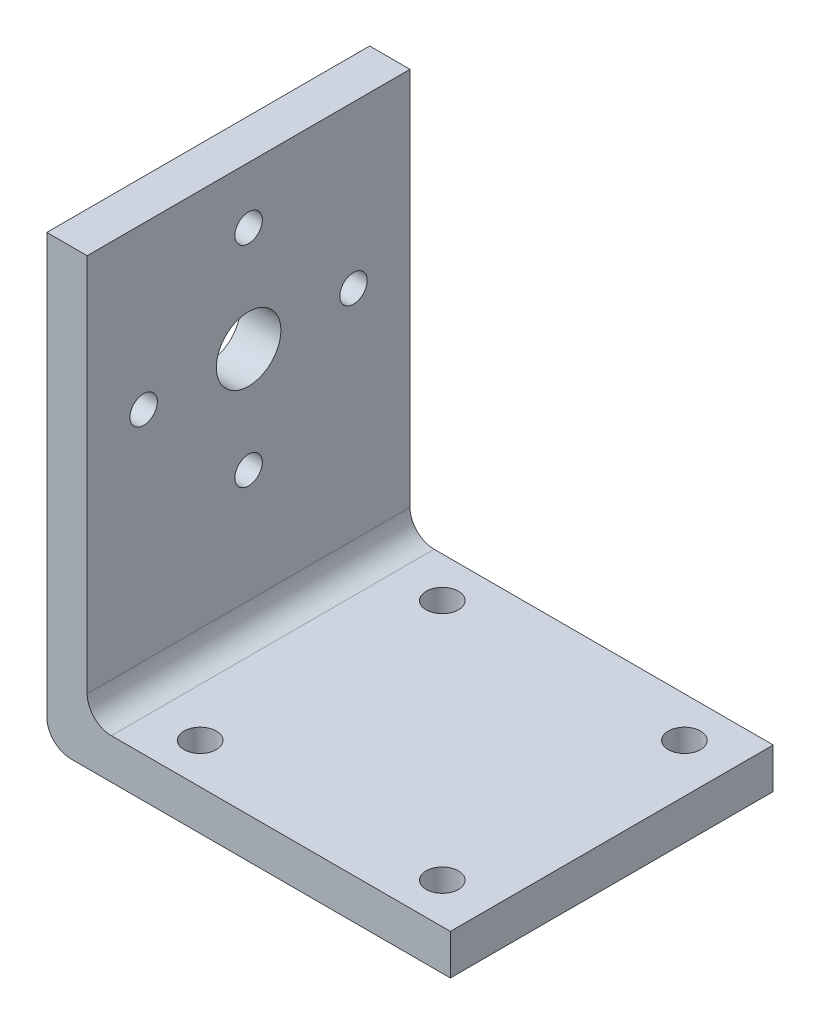
ISO-10303-21;
HEADER;
FILE_DESCRIPTION(('STEP AP214'),'2;1');
FILE_NAME('part.step','',(''),(''),'','','');
FILE_SCHEMA(('AUTOMOTIVE_DESIGN { 1 0 10303 214 1 1 1 1 }'));
ENDSEC;
DATA;
#1=APPLICATION_CONTEXT('core data for automotive mechanical design processes');
#2=APPLICATION_PROTOCOL_DEFINITION('international standard','automotive_design',2000,#1);
#3=PRODUCT_CONTEXT('',#1,'mechanical');
#4=PRODUCT('Part','Part','',(#3));
#5=PRODUCT_RELATED_PRODUCT_CATEGORY('part','',(#4));
#6=PRODUCT_DEFINITION_FORMATION('','',#4);
#7=PRODUCT_DEFINITION_CONTEXT('part definition',#1,'design');
#8=PRODUCT_DEFINITION('design','',#6,#7);
#9=PRODUCT_DEFINITION_SHAPE('','',#8);
#10=(LENGTH_UNIT() NAMED_UNIT(*) SI_UNIT(.MILLI.,.METRE.));
#11=(NAMED_UNIT(*) PLANE_ANGLE_UNIT() SI_UNIT($,.RADIAN.));
#12=(NAMED_UNIT(*) SI_UNIT($,.STERADIAN.) SOLID_ANGLE_UNIT());
#13=UNCERTAINTY_MEASURE_WITH_UNIT(LENGTH_MEASURE(1.E-05),#10,'distance_accuracy_value','');
#14=(GEOMETRIC_REPRESENTATION_CONTEXT(3) GLOBAL_UNCERTAINTY_ASSIGNED_CONTEXT((#13)) GLOBAL_UNIT_ASSIGNED_CONTEXT((#10,
#11,#12)) REPRESENTATION_CONTEXT('',''));
#15=CARTESIAN_POINT('',(0.,0.,0.));
#16=DIRECTION('',(0.,0.,1.));
#17=DIRECTION('',(1.,0.,0.));
#18=AXIS2_PLACEMENT_3D('',#15,#16,#17);
#19=CARTESIAN_POINT('',(0.,5.,0.));
#20=DIRECTION('',(1.,0.,0.));
#21=DIRECTION('',(0.,0.,-1.));
#22=AXIS2_PLACEMENT_3D('',#19,#20,#21);
#23=PLANE('',#22);
#24=CARTESIAN_POINT('',(0.,35.,7.));
#25=DIRECTION('',(-1.,0.,0.));
#26=DIRECTION('',(0.,0.,1.));
#27=AXIS2_PLACEMENT_3D('',#24,#25,#26);
#28=CIRCLE('',#27,1.7);
#29=CARTESIAN_POINT('',(0.,35.,8.7));
#30=VERTEX_POINT('',#29);
#31=EDGE_CURVE('E322',#30,#30,#28,.T.);
#32=ORIENTED_EDGE('',*,*,#31,.F.);
#33=EDGE_LOOP('',(#32));
#34=FACE_BOUND('',#33,.T.);
#35=CARTESIAN_POINT('',(0.,35.,33.));
#36=DIRECTION('',(-1.,0.,0.));
#37=DIRECTION('',(0.,0.,1.));
#38=AXIS2_PLACEMENT_3D('',#35,#36,#37);
#39=CIRCLE('',#38,1.7);
#40=CARTESIAN_POINT('',(0.,35.,34.7));
#41=VERTEX_POINT('',#40);
#42=EDGE_CURVE('E327',#41,#41,#39,.T.);
#43=ORIENTED_EDGE('',*,*,#42,.F.);
#44=EDGE_LOOP('',(#43));
#45=FACE_BOUND('',#44,.T.);
#46=CARTESIAN_POINT('',(0.,22.,20.));
#47=DIRECTION('',(-1.,0.,0.));
#48=DIRECTION('',(0.,0.,1.));
#49=AXIS2_PLACEMENT_3D('',#46,#47,#48);
#50=CIRCLE('',#49,1.7);
#51=CARTESIAN_POINT('',(0.,22.,21.7));
#52=VERTEX_POINT('',#51);
#53=EDGE_CURVE('E335',#52,#52,#50,.T.);
#54=ORIENTED_EDGE('',*,*,#53,.F.);
#55=EDGE_LOOP('',(#54));
#56=FACE_BOUND('',#55,.T.);
#57=CARTESIAN_POINT('',(0.,48.,20.));
#58=DIRECTION('',(-1.,0.,0.));
#59=DIRECTION('',(0.,0.,1.));
#60=AXIS2_PLACEMENT_3D('',#57,#58,#59);
#61=CIRCLE('',#60,1.7);
#62=CARTESIAN_POINT('',(0.,48.,21.7));
#63=VERTEX_POINT('',#62);
#64=EDGE_CURVE('E343',#63,#63,#61,.T.);
#65=ORIENTED_EDGE('',*,*,#64,.F.);
#66=EDGE_LOOP('',(#65));
#67=FACE_BOUND('',#66,.T.);
#68=CARTESIAN_POINT('',(0.,35.,20.));
#69=DIRECTION('',(-1.,0.,0.));
#70=DIRECTION('',(0.,0.,1.));
#71=AXIS2_PLACEMENT_3D('',#68,#69,#70);
#72=CIRCLE('',#71,4.);
#73=CARTESIAN_POINT('',(0.,35.,24.));
#74=VERTEX_POINT('',#73);
#75=EDGE_CURVE('E138',#74,#74,#72,.T.);
#76=ORIENTED_EDGE('',*,*,#75,.F.);
#77=EDGE_LOOP('',(#76));
#78=FACE_BOUND('',#77,.T.);
#79=DIRECTION('',(0.,-1.,0.));
#80=VECTOR('',#79,1.);
#81=CARTESIAN_POINT('',(0.,5.,0.));
#82=LINE('',#81,#80);
#83=CARTESIAN_POINT('',(0.,55.,0.));
#84=VERTEX_POINT('',#83);
#85=CARTESIAN_POINT('',(0.,3.,0.));
#86=VERTEX_POINT('',#85);
#87=EDGE_CURVE('E164',#84,#86,#82,.T.);
#88=ORIENTED_EDGE('',*,*,#87,.T.);
#89=DIRECTION('',(0.,0.,1.));
#90=VECTOR('',#89,1.);
#91=CARTESIAN_POINT('',(0.,3.,0.));
#92=LINE('',#91,#90);
#93=CARTESIAN_POINT('',(0.,3.,40.));
#94=VERTEX_POINT('',#93);
#95=EDGE_CURVE('E114',#86,#94,#92,.T.);
#96=ORIENTED_EDGE('',*,*,#95,.T.);
#97=DIRECTION('',(0.,-1.,0.));
#98=VECTOR('',#97,1.);
#99=CARTESIAN_POINT('',(0.,5.,40.));
#100=LINE('',#99,#98);
#101=CARTESIAN_POINT('',(0.,55.,40.));
#102=VERTEX_POINT('',#101);
#103=EDGE_CURVE('E108',#102,#94,#100,.T.);
#104=ORIENTED_EDGE('',*,*,#103,.F.);
#105=DIRECTION('',(0.,0.,1.));
#106=VECTOR('',#105,1.);
#107=CARTESIAN_POINT('',(0.,55.,0.));
#108=LINE('',#107,#106);
#109=EDGE_CURVE('E112',#84,#102,#108,.T.);
#110=ORIENTED_EDGE('',*,*,#109,.F.);
#111=EDGE_LOOP('',(#88,#96,#104,#110));
#112=FACE_BOUND('',#111,.T.);
#113=ADVANCED_FACE('F42',(#34,#45,#56,#67,#78,#112),#23,.F.);
#114=CARTESIAN_POINT('',(0.,5.,40.));
#115=DIRECTION('',(0.,0.,-1.));
#116=DIRECTION('',(-1.,0.,0.));
#117=AXIS2_PLACEMENT_3D('',#114,#115,#116);
#118=PLANE('',#117);
#119=ORIENTED_EDGE('',*,*,#103,.T.);
#120=CARTESIAN_POINT('',(3.00000000000001,3.,40.));
#121=DIRECTION('',(0.,0.,-1.));
#122=DIRECTION('',(-1.,0.,0.));
#123=AXIS2_PLACEMENT_3D('',#120,#121,#122);
#124=CIRCLE('',#123,3.);
#125=CARTESIAN_POINT('',(3.00000000000001,0.,40.));
#126=VERTEX_POINT('',#125);
#127=EDGE_CURVE('E66',#94,#126,#124,.F.);
#128=ORIENTED_EDGE('',*,*,#127,.T.);
#129=DIRECTION('',(1.,0.,0.));
#130=VECTOR('',#129,1.);
#131=CARTESIAN_POINT('',(0.,0.,40.));
#132=LINE('',#131,#130);
#133=CARTESIAN_POINT('',(50.,0.,40.));
#134=VERTEX_POINT('',#133);
#135=EDGE_CURVE('E152',#126,#134,#132,.T.);
#136=ORIENTED_EDGE('',*,*,#135,.T.);
#137=DIRECTION('',(0.,-1.,0.));
#138=VECTOR('',#137,1.);
#139=CARTESIAN_POINT('',(50.,5.,40.));
#140=LINE('',#139,#138);
#141=CARTESIAN_POINT('',(50.,5.,40.));
#142=VERTEX_POINT('',#141);
#143=EDGE_CURVE('E117',#142,#134,#140,.T.);
#144=ORIENTED_EDGE('',*,*,#143,.F.);
#145=DIRECTION('',(1.,0.,0.));
#146=VECTOR('',#145,1.);
#147=CARTESIAN_POINT('',(0.,5.,40.));
#148=LINE('',#147,#146);
#149=CARTESIAN_POINT('',(8.00000000000001,5.,40.));
#150=VERTEX_POINT('',#149);
#151=EDGE_CURVE('E153',#150,#142,#148,.T.);
#152=ORIENTED_EDGE('',*,*,#151,.F.);
#153=CARTESIAN_POINT('',(8.00000000000001,8.,40.));
#154=DIRECTION('',(0.,0.,-1.));
#155=DIRECTION('',(-1.,0.,0.));
#156=AXIS2_PLACEMENT_3D('',#153,#154,#155);
#157=CIRCLE('',#156,3.);
#158=CARTESIAN_POINT('',(5.00000000000001,8.,40.));
#159=VERTEX_POINT('',#158);
#160=EDGE_CURVE('E11',#150,#159,#157,.T.);
#161=ORIENTED_EDGE('',*,*,#160,.T.);
#162=DIRECTION('',(0.,-1.,0.));
#163=VECTOR('',#162,1.);
#164=CARTESIAN_POINT('',(5.00000000000001,55.,40.));
#165=LINE('',#164,#163);
#166=CARTESIAN_POINT('',(5.00000000000001,55.,40.));
#167=VERTEX_POINT('',#166);
#168=EDGE_CURVE('E123',#167,#159,#165,.T.);
#169=ORIENTED_EDGE('',*,*,#168,.F.);
#170=DIRECTION('',(1.,0.,0.));
#171=VECTOR('',#170,1.);
#172=CARTESIAN_POINT('',(0.,55.,40.));
#173=LINE('',#172,#171);
#174=EDGE_CURVE('E120',#102,#167,#173,.T.);
#175=ORIENTED_EDGE('',*,*,#174,.F.);
#176=EDGE_LOOP('',(#119,#128,#136,#144,#152,#161,#169,#175));
#177=FACE_BOUND('',#176,.T.);
#178=ADVANCED_FACE('F121',(#177),#118,.F.);
#179=CARTESIAN_POINT('',(50.,5.,0.));
#180=DIRECTION('',(-1.,0.,0.));
#181=DIRECTION('',(0.,0.,1.));
#182=AXIS2_PLACEMENT_3D('',#179,#180,#181);
#183=PLANE('',#182);
#184=DIRECTION('',(0.,0.,-1.));
#185=VECTOR('',#184,1.);
#186=CARTESIAN_POINT('',(50.,0.,0.));
#187=LINE('',#186,#185);
#188=CARTESIAN_POINT('',(50.,0.,0.));
#189=VERTEX_POINT('',#188);
#190=EDGE_CURVE('E167',#134,#189,#187,.T.);
#191=ORIENTED_EDGE('',*,*,#190,.T.);
#192=DIRECTION('',(0.,-1.,0.));
#193=VECTOR('',#192,1.);
#194=CARTESIAN_POINT('',(50.,5.,0.));
#195=LINE('',#194,#193);
#196=CARTESIAN_POINT('',(50.,5.,0.));
#197=VERTEX_POINT('',#196);
#198=EDGE_CURVE('E174',#197,#189,#195,.T.);
#199=ORIENTED_EDGE('',*,*,#198,.F.);
#200=DIRECTION('',(0.,0.,-1.));
#201=VECTOR('',#200,1.);
#202=CARTESIAN_POINT('',(50.,5.,0.));
#203=LINE('',#202,#201);
#204=EDGE_CURVE('E156',#142,#197,#203,.T.);
#205=ORIENTED_EDGE('',*,*,#204,.F.);
#206=ORIENTED_EDGE('',*,*,#143,.T.);
#207=EDGE_LOOP('',(#191,#199,#205,#206));
#208=FACE_BOUND('',#207,.T.);
#209=ADVANCED_FACE('F230',(#208),#183,.F.);
#210=CARTESIAN_POINT('',(0.,5.,0.));
#211=DIRECTION('',(0.,0.,1.));
#212=DIRECTION('',(1.,0.,0.));
#213=AXIS2_PLACEMENT_3D('',#210,#211,#212);
#214=PLANE('',#213);
#215=DIRECTION('',(-1.,0.,0.));
#216=VECTOR('',#215,1.);
#217=CARTESIAN_POINT('',(0.,0.,0.));
#218=LINE('',#217,#216);
#219=CARTESIAN_POINT('',(3.,0.,0.));
#220=VERTEX_POINT('',#219);
#221=EDGE_CURVE('E157',#189,#220,#218,.T.);
#222=ORIENTED_EDGE('',*,*,#221,.T.);
#223=CARTESIAN_POINT('',(3.,3.,0.));
#224=DIRECTION('',(0.,0.,1.));
#225=DIRECTION('',(1.,0.,0.));
#226=AXIS2_PLACEMENT_3D('',#223,#224,#225);
#227=CIRCLE('',#226,3.);
#228=EDGE_CURVE('E193',#220,#86,#227,.F.);
#229=ORIENTED_EDGE('',*,*,#228,.T.);
#230=ORIENTED_EDGE('',*,*,#87,.F.);
#231=DIRECTION('',(-1.,0.,0.));
#232=VECTOR('',#231,1.);
#233=CARTESIAN_POINT('',(0.,55.,0.));
#234=LINE('',#233,#232);
#235=CARTESIAN_POINT('',(5.,55.,0.));
#236=VERTEX_POINT('',#235);
#237=EDGE_CURVE('E132',#236,#84,#234,.T.);
#238=ORIENTED_EDGE('',*,*,#237,.F.);
#239=DIRECTION('',(0.,-1.,0.));
#240=VECTOR('',#239,1.);
#241=CARTESIAN_POINT('',(5.,55.,0.));
#242=LINE('',#241,#240);
#243=CARTESIAN_POINT('',(5.,8.,0.));
#244=VERTEX_POINT('',#243);
#245=EDGE_CURVE('E146',#236,#244,#242,.T.);
#246=ORIENTED_EDGE('',*,*,#245,.T.);
#247=CARTESIAN_POINT('',(8.,8.,0.));
#248=DIRECTION('',(0.,0.,1.));
#249=DIRECTION('',(1.,0.,0.));
#250=AXIS2_PLACEMENT_3D('',#247,#248,#249);
#251=CIRCLE('',#250,3.);
#252=CARTESIAN_POINT('',(8.,5.,0.));
#253=VERTEX_POINT('',#252);
#254=EDGE_CURVE('E51',#244,#253,#251,.T.);
#255=ORIENTED_EDGE('',*,*,#254,.T.);
#256=DIRECTION('',(-1.,0.,0.));
#257=VECTOR('',#256,1.);
#258=CARTESIAN_POINT('',(0.,5.,0.));
#259=LINE('',#258,#257);
#260=EDGE_CURVE('E160',#197,#253,#259,.T.);
#261=ORIENTED_EDGE('',*,*,#260,.F.);
#262=ORIENTED_EDGE('',*,*,#198,.T.);
#263=EDGE_LOOP('',(#222,#229,#230,#238,#246,#255,#261,#262));
#264=FACE_BOUND('',#263,.T.);
#265=ADVANCED_FACE('F198',(#264),#214,.F.);
#266=CARTESIAN_POINT('',(0.,5.,0.));
#267=DIRECTION('',(0.,1.,0.));
#268=DIRECTION('',(0.,0.,1.));
#269=AXIS2_PLACEMENT_3D('',#266,#267,#268);
#270=PLANE('',#269);
#271=CARTESIAN_POINT('',(14.,5.,35.));
#272=DIRECTION('',(0.,1.,0.));
#273=DIRECTION('',(0.,0.,1.));
#274=AXIS2_PLACEMENT_3D('',#271,#272,#273);
#275=CIRCLE('',#274,2.);
#276=CARTESIAN_POINT('',(14.,5.,37.));
#277=VERTEX_POINT('',#276);
#278=EDGE_CURVE('E302',#277,#277,#275,.T.);
#279=ORIENTED_EDGE('',*,*,#278,.F.);
#280=EDGE_LOOP('',(#279));
#281=FACE_BOUND('',#280,.T.);
#282=CARTESIAN_POINT('',(44.,5.,5.));
#283=DIRECTION('',(0.,1.,0.));
#284=DIRECTION('',(0.,0.,1.));
#285=AXIS2_PLACEMENT_3D('',#282,#283,#284);
#286=CIRCLE('',#285,2.);
#287=CARTESIAN_POINT('',(44.,5.,7.));
#288=VERTEX_POINT('',#287);
#289=EDGE_CURVE('E303',#288,#288,#286,.T.);
#290=ORIENTED_EDGE('',*,*,#289,.F.);
#291=EDGE_LOOP('',(#290));
#292=FACE_BOUND('',#291,.T.);
#293=CARTESIAN_POINT('',(44.,5.,35.));
#294=DIRECTION('',(0.,1.,0.));
#295=DIRECTION('',(0.,0.,1.));
#296=AXIS2_PLACEMENT_3D('',#293,#294,#295);
#297=CIRCLE('',#296,2.);
#298=CARTESIAN_POINT('',(44.,5.,37.));
#299=VERTEX_POINT('',#298);
#300=EDGE_CURVE('E287',#299,#299,#297,.T.);
#301=ORIENTED_EDGE('',*,*,#300,.F.);
#302=EDGE_LOOP('',(#301));
#303=FACE_BOUND('',#302,.T.);
#304=CARTESIAN_POINT('',(14.,5.,5.));
#305=DIRECTION('',(0.,1.,0.));
#306=DIRECTION('',(0.,0.,1.));
#307=AXIS2_PLACEMENT_3D('',#304,#305,#306);
#308=CIRCLE('',#307,2.);
#309=CARTESIAN_POINT('',(14.,5.,7.));
#310=VERTEX_POINT('',#309);
#311=EDGE_CURVE('E307',#310,#310,#308,.T.);
#312=ORIENTED_EDGE('',*,*,#311,.F.);
#313=EDGE_LOOP('',(#312));
#314=FACE_BOUND('',#313,.T.);
#315=ORIENTED_EDGE('',*,*,#260,.T.);
#316=DIRECTION('',(0.,0.,-1.));
#317=VECTOR('',#316,1.);
#318=CARTESIAN_POINT('',(8.,5.,0.));
#319=LINE('',#318,#317);
#320=EDGE_CURVE('E184',#253,#150,#319,.F.);
#321=ORIENTED_EDGE('',*,*,#320,.T.);
#322=ORIENTED_EDGE('',*,*,#151,.T.);
#323=ORIENTED_EDGE('',*,*,#204,.T.);
#324=EDGE_LOOP('',(#315,#321,#322,#323));
#325=FACE_BOUND('',#324,.T.);
#326=ADVANCED_FACE('F204',(#281,#292,#303,#314,#325),#270,.T.);
#327=CARTESIAN_POINT('',(0.,0.,0.));
#328=DIRECTION('',(0.,1.,0.));
#329=DIRECTION('',(0.,0.,1.));
#330=AXIS2_PLACEMENT_3D('',#327,#328,#329);
#331=PLANE('',#330);
#332=CARTESIAN_POINT('',(14.,0.,35.));
#333=DIRECTION('',(0.,1.,0.));
#334=DIRECTION('',(0.,0.,1.));
#335=AXIS2_PLACEMENT_3D('',#332,#333,#334);
#336=CIRCLE('',#335,2.);
#337=CARTESIAN_POINT('',(14.,0.,37.));
#338=VERTEX_POINT('',#337);
#339=EDGE_CURVE('E298',#338,#338,#336,.F.);
#340=ORIENTED_EDGE('',*,*,#339,.F.);
#341=EDGE_LOOP('',(#340));
#342=FACE_BOUND('',#341,.T.);
#343=CARTESIAN_POINT('',(44.,0.,5.));
#344=DIRECTION('',(0.,1.,0.));
#345=DIRECTION('',(0.,0.,1.));
#346=AXIS2_PLACEMENT_3D('',#343,#344,#345);
#347=CIRCLE('',#346,2.);
#348=CARTESIAN_POINT('',(44.,0.,7.));
#349=VERTEX_POINT('',#348);
#350=EDGE_CURVE('E295',#349,#349,#347,.F.);
#351=ORIENTED_EDGE('',*,*,#350,.F.);
#352=EDGE_LOOP('',(#351));
#353=FACE_BOUND('',#352,.T.);
#354=CARTESIAN_POINT('',(44.,0.,35.));
#355=DIRECTION('',(0.,1.,0.));
#356=DIRECTION('',(0.,0.,1.));
#357=AXIS2_PLACEMENT_3D('',#354,#355,#356);
#358=CIRCLE('',#357,2.);
#359=CARTESIAN_POINT('',(44.,0.,37.));
#360=VERTEX_POINT('',#359);
#361=EDGE_CURVE('E290',#360,#360,#358,.F.);
#362=ORIENTED_EDGE('',*,*,#361,.F.);
#363=EDGE_LOOP('',(#362));
#364=FACE_BOUND('',#363,.T.);
#365=CARTESIAN_POINT('',(14.,0.,5.));
#366=DIRECTION('',(0.,1.,0.));
#367=DIRECTION('',(0.,0.,1.));
#368=AXIS2_PLACEMENT_3D('',#365,#366,#367);
#369=CIRCLE('',#368,2.);
#370=CARTESIAN_POINT('',(14.,0.,7.));
#371=VERTEX_POINT('',#370);
#372=EDGE_CURVE('E317',#371,#371,#369,.F.);
#373=ORIENTED_EDGE('',*,*,#372,.F.);
#374=EDGE_LOOP('',(#373));
#375=FACE_BOUND('',#374,.T.);
#376=ORIENTED_EDGE('',*,*,#135,.F.);
#377=DIRECTION('',(0.,0.,1.));
#378=VECTOR('',#377,1.);
#379=CARTESIAN_POINT('',(3.,0.,0.));
#380=LINE('',#379,#378);
#381=EDGE_CURVE('E58',#126,#220,#380,.F.);
#382=ORIENTED_EDGE('',*,*,#381,.T.);
#383=ORIENTED_EDGE('',*,*,#221,.F.);
#384=ORIENTED_EDGE('',*,*,#190,.F.);
#385=EDGE_LOOP('',(#376,#382,#383,#384));
#386=FACE_BOUND('',#385,.T.);
#387=ADVANCED_FACE('F240',(#342,#353,#364,#375,#386),#331,.F.);
#388=CARTESIAN_POINT('',(5.,55.,0.));
#389=DIRECTION('',(-1.,0.,0.));
#390=DIRECTION('',(0.,0.,1.));
#391=AXIS2_PLACEMENT_3D('',#388,#389,#390);
#392=PLANE('',#391);
#393=CARTESIAN_POINT('',(5.,35.,7.));
#394=DIRECTION('',(-1.,0.,0.));
#395=DIRECTION('',(0.,0.,1.));
#396=AXIS2_PLACEMENT_3D('',#393,#394,#395);
#397=CIRCLE('',#396,1.7);
#398=CARTESIAN_POINT('',(5.,35.,8.7));
#399=VERTEX_POINT('',#398);
#400=EDGE_CURVE('E326',#399,#399,#397,.F.);
#401=ORIENTED_EDGE('',*,*,#400,.F.);
#402=EDGE_LOOP('',(#401));
#403=FACE_BOUND('',#402,.T.);
#404=CARTESIAN_POINT('',(5.,35.,33.));
#405=DIRECTION('',(-1.,0.,0.));
#406=DIRECTION('',(0.,0.,1.));
#407=AXIS2_PLACEMENT_3D('',#404,#405,#406);
#408=CIRCLE('',#407,1.7);
#409=CARTESIAN_POINT('',(5.00000000000001,35.,34.7));
#410=VERTEX_POINT('',#409);
#411=EDGE_CURVE('E331',#410,#410,#408,.F.);
#412=ORIENTED_EDGE('',*,*,#411,.F.);
#413=EDGE_LOOP('',(#412));
#414=FACE_BOUND('',#413,.T.);
#415=CARTESIAN_POINT('',(5.,22.,20.));
#416=DIRECTION('',(-1.,0.,0.));
#417=DIRECTION('',(0.,0.,1.));
#418=AXIS2_PLACEMENT_3D('',#415,#416,#417);
#419=CIRCLE('',#418,1.7);
#420=CARTESIAN_POINT('',(5.00000000000001,22.,21.7));
#421=VERTEX_POINT('',#420);
#422=EDGE_CURVE('E339',#421,#421,#419,.F.);
#423=ORIENTED_EDGE('',*,*,#422,.F.);
#424=EDGE_LOOP('',(#423));
#425=FACE_BOUND('',#424,.T.);
#426=CARTESIAN_POINT('',(5.,48.,20.));
#427=DIRECTION('',(-1.,0.,0.));
#428=DIRECTION('',(0.,0.,1.));
#429=AXIS2_PLACEMENT_3D('',#426,#427,#428);
#430=CIRCLE('',#429,1.7);
#431=CARTESIAN_POINT('',(5.00000000000001,48.,21.7));
#432=VERTEX_POINT('',#431);
#433=EDGE_CURVE('E321',#432,#432,#430,.F.);
#434=ORIENTED_EDGE('',*,*,#433,.F.);
#435=EDGE_LOOP('',(#434));
#436=FACE_BOUND('',#435,.T.);
#437=CARTESIAN_POINT('',(5.,35.,20.));
#438=DIRECTION('',(-1.,0.,0.));
#439=DIRECTION('',(0.,0.,1.));
#440=AXIS2_PLACEMENT_3D('',#437,#438,#439);
#441=CIRCLE('',#440,4.);
#442=CARTESIAN_POINT('',(5.00000000000001,35.,24.));
#443=VERTEX_POINT('',#442);
#444=EDGE_CURVE('E134',#443,#443,#441,.F.);
#445=ORIENTED_EDGE('',*,*,#444,.F.);
#446=EDGE_LOOP('',(#445));
#447=FACE_BOUND('',#446,.T.);
#448=ORIENTED_EDGE('',*,*,#168,.T.);
#449=DIRECTION('',(0.,0.,-1.));
#450=VECTOR('',#449,1.);
#451=CARTESIAN_POINT('',(5.,8.,0.));
#452=LINE('',#451,#450);
#453=EDGE_CURVE('E116',#159,#244,#452,.T.);
#454=ORIENTED_EDGE('',*,*,#453,.T.);
#455=ORIENTED_EDGE('',*,*,#245,.F.);
#456=DIRECTION('',(0.,0.,-1.));
#457=VECTOR('',#456,1.);
#458=CARTESIAN_POINT('',(5.,55.,0.));
#459=LINE('',#458,#457);
#460=EDGE_CURVE('E127',#167,#236,#459,.T.);
#461=ORIENTED_EDGE('',*,*,#460,.F.);
#462=EDGE_LOOP('',(#448,#454,#455,#461));
#463=FACE_BOUND('',#462,.T.);
#464=ADVANCED_FACE('F212',(#403,#414,#425,#436,#447,#463),#392,.F.);
#465=CARTESIAN_POINT('',(0.,55.,0.));
#466=DIRECTION('',(0.,1.,0.));
#467=DIRECTION('',(0.,0.,1.));
#468=AXIS2_PLACEMENT_3D('',#465,#466,#467);
#469=PLANE('',#468);
#470=ORIENTED_EDGE('',*,*,#109,.T.);
#471=ORIENTED_EDGE('',*,*,#174,.T.);
#472=ORIENTED_EDGE('',*,*,#460,.T.);
#473=ORIENTED_EDGE('',*,*,#237,.T.);
#474=EDGE_LOOP('',(#470,#471,#472,#473));
#475=FACE_BOUND('',#474,.T.);
#476=ADVANCED_FACE('F130',(#475),#469,.T.);
#477=CARTESIAN_POINT('',(8.,8.,0.));
#478=DIRECTION('',(0.,0.,-1.));
#479=DIRECTION('',(-1.,0.,0.));
#480=AXIS2_PLACEMENT_3D('',#477,#478,#479);
#481=CYLINDRICAL_SURFACE('',#480,3.);
#482=ORIENTED_EDGE('',*,*,#160,.F.);
#483=ORIENTED_EDGE('',*,*,#320,.F.);
#484=ORIENTED_EDGE('',*,*,#254,.F.);
#485=ORIENTED_EDGE('',*,*,#453,.F.);
#486=EDGE_LOOP('',(#482,#483,#484,#485));
#487=FACE_BOUND('',#486,.T.);
#488=ADVANCED_FACE('F209',(#487),#481,.F.);
#489=CARTESIAN_POINT('',(3.,3.,0.));
#490=DIRECTION('',(0.,0.,1.));
#491=DIRECTION('',(1.,0.,0.));
#492=AXIS2_PLACEMENT_3D('',#489,#490,#491);
#493=CYLINDRICAL_SURFACE('',#492,3.);
#494=ORIENTED_EDGE('',*,*,#228,.F.);
#495=ORIENTED_EDGE('',*,*,#381,.F.);
#496=ORIENTED_EDGE('',*,*,#127,.F.);
#497=ORIENTED_EDGE('',*,*,#95,.F.);
#498=EDGE_LOOP('',(#494,#495,#496,#497));
#499=FACE_BOUND('',#498,.T.);
#500=ADVANCED_FACE('F44',(#499),#493,.T.);
#501=CARTESIAN_POINT('',(50.001,35.,20.));
#502=DIRECTION('',(-1.,0.,0.));
#503=DIRECTION('',(0.,0.,1.));
#504=AXIS2_PLACEMENT_3D('',#501,#502,#503);
#505=CYLINDRICAL_SURFACE('',#504,4.);
#506=ORIENTED_EDGE('',*,*,#75,.T.);
#507=EDGE_LOOP('',(#506));
#508=FACE_BOUND('',#507,.T.);
#509=ORIENTED_EDGE('',*,*,#444,.T.);
#510=EDGE_LOOP('',(#509));
#511=FACE_BOUND('',#510,.T.);
#512=ADVANCED_FACE('F216',(#508,#511),#505,.F.);
#513=CARTESIAN_POINT('',(50.001,48.,20.));
#514=DIRECTION('',(-1.,0.,0.));
#515=DIRECTION('',(0.,0.,1.));
#516=AXIS2_PLACEMENT_3D('',#513,#514,#515);
#517=CYLINDRICAL_SURFACE('',#516,1.7);
#518=ORIENTED_EDGE('',*,*,#64,.T.);
#519=EDGE_LOOP('',(#518));
#520=FACE_BOUND('',#519,.T.);
#521=ORIENTED_EDGE('',*,*,#433,.T.);
#522=EDGE_LOOP('',(#521));
#523=FACE_BOUND('',#522,.T.);
#524=ADVANCED_FACE('F221',(#520,#523),#517,.F.);
#525=CARTESIAN_POINT('',(50.001,22.,20.));
#526=DIRECTION('',(-1.,0.,0.));
#527=DIRECTION('',(0.,0.,1.));
#528=AXIS2_PLACEMENT_3D('',#525,#526,#527);
#529=CYLINDRICAL_SURFACE('',#528,1.7);
#530=ORIENTED_EDGE('',*,*,#53,.T.);
#531=EDGE_LOOP('',(#530));
#532=FACE_BOUND('',#531,.T.);
#533=ORIENTED_EDGE('',*,*,#422,.T.);
#534=EDGE_LOOP('',(#533));
#535=FACE_BOUND('',#534,.T.);
#536=ADVANCED_FACE('F254',(#532,#535),#529,.F.);
#537=CARTESIAN_POINT('',(50.001,35.,33.));
#538=DIRECTION('',(-1.,0.,0.));
#539=DIRECTION('',(0.,0.,1.));
#540=AXIS2_PLACEMENT_3D('',#537,#538,#539);
#541=CYLINDRICAL_SURFACE('',#540,1.7);
#542=ORIENTED_EDGE('',*,*,#42,.T.);
#543=EDGE_LOOP('',(#542));
#544=FACE_BOUND('',#543,.T.);
#545=ORIENTED_EDGE('',*,*,#411,.T.);
#546=EDGE_LOOP('',(#545));
#547=FACE_BOUND('',#546,.T.);
#548=ADVANCED_FACE('F258',(#544,#547),#541,.F.);
#549=CARTESIAN_POINT('',(50.001,35.,6.99999999999998));
#550=DIRECTION('',(-1.,0.,0.));
#551=DIRECTION('',(0.,0.,1.));
#552=AXIS2_PLACEMENT_3D('',#549,#550,#551);
#553=CYLINDRICAL_SURFACE('',#552,1.7);
#554=ORIENTED_EDGE('',*,*,#31,.T.);
#555=EDGE_LOOP('',(#554));
#556=FACE_BOUND('',#555,.T.);
#557=ORIENTED_EDGE('',*,*,#400,.T.);
#558=EDGE_LOOP('',(#557));
#559=FACE_BOUND('',#558,.T.);
#560=ADVANCED_FACE('F262',(#556,#559),#553,.F.);
#561=CARTESIAN_POINT('',(14.,-0.00100000000000013,5.));
#562=DIRECTION('',(0.,1.,0.));
#563=DIRECTION('',(0.,0.,1.));
#564=AXIS2_PLACEMENT_3D('',#561,#562,#563);
#565=CYLINDRICAL_SURFACE('',#564,2.);
#566=ORIENTED_EDGE('',*,*,#311,.T.);
#567=EDGE_LOOP('',(#566));
#568=FACE_BOUND('',#567,.T.);
#569=ORIENTED_EDGE('',*,*,#372,.T.);
#570=EDGE_LOOP('',(#569));
#571=FACE_BOUND('',#570,.T.);
#572=ADVANCED_FACE('F266',(#568,#571),#565,.F.);
#573=CARTESIAN_POINT('',(44.,-0.00100000000000013,35.));
#574=DIRECTION('',(0.,1.,0.));
#575=DIRECTION('',(0.,0.,1.));
#576=AXIS2_PLACEMENT_3D('',#573,#574,#575);
#577=CYLINDRICAL_SURFACE('',#576,2.);
#578=ORIENTED_EDGE('',*,*,#300,.T.);
#579=EDGE_LOOP('',(#578));
#580=FACE_BOUND('',#579,.T.);
#581=ORIENTED_EDGE('',*,*,#361,.T.);
#582=EDGE_LOOP('',(#581));
#583=FACE_BOUND('',#582,.T.);
#584=ADVANCED_FACE('F270',(#580,#583),#577,.F.);
#585=CARTESIAN_POINT('',(44.,-0.00100000000000013,5.));
#586=DIRECTION('',(0.,1.,0.));
#587=DIRECTION('',(0.,0.,1.));
#588=AXIS2_PLACEMENT_3D('',#585,#586,#587);
#589=CYLINDRICAL_SURFACE('',#588,2.);
#590=ORIENTED_EDGE('',*,*,#289,.T.);
#591=EDGE_LOOP('',(#590));
#592=FACE_BOUND('',#591,.T.);
#593=ORIENTED_EDGE('',*,*,#350,.T.);
#594=EDGE_LOOP('',(#593));
#595=FACE_BOUND('',#594,.T.);
#596=ADVANCED_FACE('F272',(#592,#595),#589,.F.);
#597=CARTESIAN_POINT('',(14.,-0.00100000000000013,35.));
#598=DIRECTION('',(0.,1.,0.));
#599=DIRECTION('',(0.,0.,1.));
#600=AXIS2_PLACEMENT_3D('',#597,#598,#599);
#601=CYLINDRICAL_SURFACE('',#600,2.);
#602=ORIENTED_EDGE('',*,*,#278,.T.);
#603=EDGE_LOOP('',(#602));
#604=FACE_BOUND('',#603,.T.);
#605=ORIENTED_EDGE('',*,*,#339,.T.);
#606=EDGE_LOOP('',(#605));
#607=FACE_BOUND('',#606,.T.);
#608=ADVANCED_FACE('F275',(#604,#607),#601,.F.);
#609=CLOSED_SHELL('',(#113,#178,#209,#265,#326,#387,#464,#476,#488,#500,#512,#524,#536,#548,
#560,#572,#584,#596,#608));
#610=MANIFOLD_SOLID_BREP('B2',#609);
#611=ADVANCED_BREP_SHAPE_REPRESENTATION('',(#18,#610),#14);
#612=SHAPE_DEFINITION_REPRESENTATION(#9,#611);
ENDSEC;
END-ISO-10303-21;
